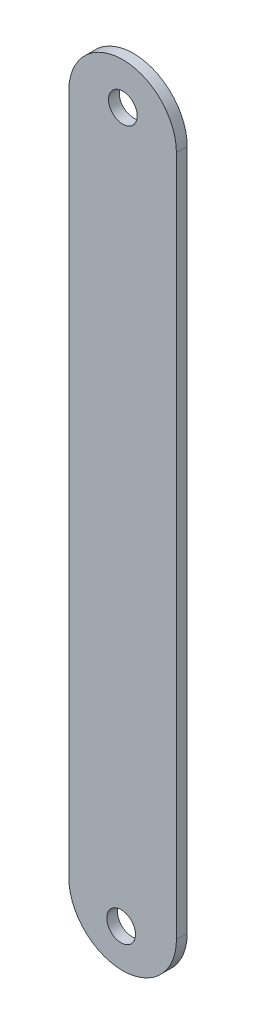
ISO-10303-21;
HEADER;
FILE_DESCRIPTION(('STEP AP214'),'2;1');
FILE_NAME('part.step','',(''),(''),'','','');
FILE_SCHEMA(('AUTOMOTIVE_DESIGN { 1 0 10303 214 1 1 1 1 }'));
ENDSEC;
DATA;
#1=APPLICATION_CONTEXT('core data for automotive mechanical design processes');
#2=APPLICATION_PROTOCOL_DEFINITION('international standard','automotive_design',2000,#1);
#3=PRODUCT_CONTEXT('',#1,'mechanical');
#4=PRODUCT('Part','Part','',(#3));
#5=PRODUCT_RELATED_PRODUCT_CATEGORY('part','',(#4));
#6=PRODUCT_DEFINITION_FORMATION('','',#4);
#7=PRODUCT_DEFINITION_CONTEXT('part definition',#1,'design');
#8=PRODUCT_DEFINITION('design','',#6,#7);
#9=PRODUCT_DEFINITION_SHAPE('','',#8);
#10=(LENGTH_UNIT() NAMED_UNIT(*) SI_UNIT(.MILLI.,.METRE.));
#11=(NAMED_UNIT(*) PLANE_ANGLE_UNIT() SI_UNIT($,.RADIAN.));
#12=(NAMED_UNIT(*) SI_UNIT($,.STERADIAN.) SOLID_ANGLE_UNIT());
#13=UNCERTAINTY_MEASURE_WITH_UNIT(LENGTH_MEASURE(1.E-05),#10,'distance_accuracy_value','');
#14=(GEOMETRIC_REPRESENTATION_CONTEXT(3) GLOBAL_UNCERTAINTY_ASSIGNED_CONTEXT((#13)) GLOBAL_UNIT_ASSIGNED_CONTEXT((#10,
#11,#12)) REPRESENTATION_CONTEXT('',''));
#15=CARTESIAN_POINT('',(0.,0.,0.));
#16=DIRECTION('',(0.,0.,1.));
#17=DIRECTION('',(1.,0.,0.));
#18=AXIS2_PLACEMENT_3D('',#15,#16,#17);
#19=CARTESIAN_POINT('',(-11.2315251364094,57.2093023255814,1.5));
#20=DIRECTION('',(0.,0.,-1.));
#21=DIRECTION('',(-1.,0.,0.));
#22=AXIS2_PLACEMENT_3D('',#19,#20,#21);
#23=CYLINDRICAL_SURFACE('',#22,7.5);
#24=CARTESIAN_POINT('',(-11.2315251364094,57.2093023255814,0.));
#25=DIRECTION('',(0.,0.,1.));
#26=DIRECTION('',(-1.,0.,0.));
#27=AXIS2_PLACEMENT_3D('',#24,#25,#26);
#28=CIRCLE('',#27,7.5);
#29=CARTESIAN_POINT('',(-3.7315251364094,57.2093023255814,0.));
#30=VERTEX_POINT('',#29);
#31=CARTESIAN_POINT('',(-18.7315251364094,57.2093023255814,0.));
#32=VERTEX_POINT('',#31);
#33=EDGE_CURVE('E117',#30,#32,#28,.T.);
#34=ORIENTED_EDGE('',*,*,#33,.T.);
#35=DIRECTION('',(0.,0.,-1.));
#36=VECTOR('',#35,1.);
#37=CARTESIAN_POINT('',(-18.7315251364094,57.2093023255814,1.5));
#38=LINE('',#37,#36);
#39=CARTESIAN_POINT('',(-18.7315251364094,57.2093023255814,1.5));
#40=VERTEX_POINT('',#39);
#41=EDGE_CURVE('E11',#40,#32,#38,.T.);
#42=ORIENTED_EDGE('',*,*,#41,.F.);
#43=CARTESIAN_POINT('',(-11.2315251364094,57.2093023255814,1.5));
#44=DIRECTION('',(0.,0.,1.));
#45=DIRECTION('',(-1.,0.,0.));
#46=AXIS2_PLACEMENT_3D('',#43,#44,#45);
#47=CIRCLE('',#46,7.5);
#48=CARTESIAN_POINT('',(-3.7315251364094,57.2093023255814,1.5));
#49=VERTEX_POINT('',#48);
#50=EDGE_CURVE('E101',#49,#40,#47,.T.);
#51=ORIENTED_EDGE('',*,*,#50,.F.);
#52=DIRECTION('',(0.,0.,-1.));
#53=VECTOR('',#52,1.);
#54=CARTESIAN_POINT('',(-3.7315251364094,57.2093023255814,1.5));
#55=LINE('',#54,#53);
#56=EDGE_CURVE('E113',#49,#30,#55,.T.);
#57=ORIENTED_EDGE('',*,*,#56,.T.);
#58=EDGE_LOOP('',(#34,#42,#51,#57));
#59=FACE_BOUND('',#58,.T.);
#60=ADVANCED_FACE('F49',(#59),#23,.T.);
#61=CARTESIAN_POINT('',(-18.7315251364094,57.2093023255814,1.5));
#62=DIRECTION('',(1.,0.,0.));
#63=DIRECTION('',(0.,1.,0.));
#64=AXIS2_PLACEMENT_3D('',#61,#62,#63);
#65=PLANE('',#64);
#66=DIRECTION('',(0.,-1.,0.));
#67=VECTOR('',#66,1.);
#68=CARTESIAN_POINT('',(-18.7315251364094,57.2093023255814,0.));
#69=LINE('',#68,#67);
#70=CARTESIAN_POINT('',(-18.7315251364094,-37.7906976744186,0.));
#71=VERTEX_POINT('',#70);
#72=EDGE_CURVE('E106',#32,#71,#69,.T.);
#73=ORIENTED_EDGE('',*,*,#72,.T.);
#74=DIRECTION('',(0.,0.,-1.));
#75=VECTOR('',#74,1.);
#76=CARTESIAN_POINT('',(-18.7315251364094,-37.7906976744186,1.5));
#77=LINE('',#76,#75);
#78=CARTESIAN_POINT('',(-18.7315251364094,-37.7906976744186,1.5));
#79=VERTEX_POINT('',#78);
#80=EDGE_CURVE('E58',#79,#71,#77,.T.);
#81=ORIENTED_EDGE('',*,*,#80,.F.);
#82=DIRECTION('',(0.,-1.,0.));
#83=VECTOR('',#82,1.);
#84=CARTESIAN_POINT('',(-18.7315251364094,57.2093023255814,1.5));
#85=LINE('',#84,#83);
#86=EDGE_CURVE('E96',#40,#79,#85,.T.);
#87=ORIENTED_EDGE('',*,*,#86,.F.);
#88=ORIENTED_EDGE('',*,*,#41,.T.);
#89=EDGE_LOOP('',(#73,#81,#87,#88));
#90=FACE_BOUND('',#89,.T.);
#91=ADVANCED_FACE('F105',(#90),#65,.F.);
#92=CARTESIAN_POINT('',(-11.2315251364094,-37.7906976744186,1.5));
#93=DIRECTION('',(0.,0.,-1.));
#94=DIRECTION('',(-1.,0.,0.));
#95=AXIS2_PLACEMENT_3D('',#92,#93,#94);
#96=CYLINDRICAL_SURFACE('',#95,7.5);
#97=CARTESIAN_POINT('',(-11.2315251364094,-37.7906976744186,0.));
#98=DIRECTION('',(0.,0.,1.));
#99=DIRECTION('',(1.,0.,0.));
#100=AXIS2_PLACEMENT_3D('',#97,#98,#99);
#101=CIRCLE('',#100,7.5);
#102=CARTESIAN_POINT('',(-3.73152513640939,-37.7906976744186,0.));
#103=VERTEX_POINT('',#102);
#104=EDGE_CURVE('E83',#71,#103,#101,.T.);
#105=ORIENTED_EDGE('',*,*,#104,.T.);
#106=DIRECTION('',(0.,0.,-1.));
#107=VECTOR('',#106,1.);
#108=CARTESIAN_POINT('',(-3.73152513640939,-37.7906976744186,1.5));
#109=LINE('',#108,#107);
#110=CARTESIAN_POINT('',(-3.73152513640939,-37.7906976744186,1.5));
#111=VERTEX_POINT('',#110);
#112=EDGE_CURVE('E108',#111,#103,#109,.T.);
#113=ORIENTED_EDGE('',*,*,#112,.F.);
#114=CARTESIAN_POINT('',(-11.2315251364094,-37.7906976744186,1.5));
#115=DIRECTION('',(0.,0.,1.));
#116=DIRECTION('',(1.,0.,0.));
#117=AXIS2_PLACEMENT_3D('',#114,#115,#116);
#118=CIRCLE('',#117,7.5);
#119=EDGE_CURVE('E99',#79,#111,#118,.T.);
#120=ORIENTED_EDGE('',*,*,#119,.F.);
#121=ORIENTED_EDGE('',*,*,#80,.T.);
#122=EDGE_LOOP('',(#105,#113,#120,#121));
#123=FACE_BOUND('',#122,.T.);
#124=ADVANCED_FACE('F109',(#123),#96,.T.);
#125=CARTESIAN_POINT('',(-3.7315251364094,57.2093023255814,1.5));
#126=DIRECTION('',(-1.,0.,0.));
#127=DIRECTION('',(0.,-1.,0.));
#128=AXIS2_PLACEMENT_3D('',#125,#126,#127);
#129=PLANE('',#128);
#130=DIRECTION('',(0.,1.,0.));
#131=VECTOR('',#130,1.);
#132=CARTESIAN_POINT('',(-3.7315251364094,57.2093023255814,0.));
#133=LINE('',#132,#131);
#134=EDGE_CURVE('E89',#103,#30,#133,.T.);
#135=ORIENTED_EDGE('',*,*,#134,.T.);
#136=ORIENTED_EDGE('',*,*,#56,.F.);
#137=DIRECTION('',(0.,1.,0.));
#138=VECTOR('',#137,1.);
#139=CARTESIAN_POINT('',(-3.7315251364094,57.2093023255814,1.5));
#140=LINE('',#139,#138);
#141=EDGE_CURVE('E66',#111,#49,#140,.T.);
#142=ORIENTED_EDGE('',*,*,#141,.F.);
#143=ORIENTED_EDGE('',*,*,#112,.T.);
#144=EDGE_LOOP('',(#135,#136,#142,#143));
#145=FACE_BOUND('',#144,.T.);
#146=ADVANCED_FACE('F131',(#145),#129,.F.);
#147=CARTESIAN_POINT('',(-11.2315251364094,57.2093023255814,1.5));
#148=DIRECTION('',(0.,0.,-1.));
#149=DIRECTION('',(-1.,0.,0.));
#150=AXIS2_PLACEMENT_3D('',#147,#148,#149);
#151=PLANE('',#150);
#152=CARTESIAN_POINT('',(-11.20285502595,58.9110441322353,1.5));
#153=DIRECTION('',(0.,0.,1.));
#154=DIRECTION('',(1.,0.,0.));
#155=AXIS2_PLACEMENT_3D('',#152,#153,#154);
#156=CIRCLE('',#155,2.);
#157=CARTESIAN_POINT('',(-9.20285502594996,58.9110441322353,1.5));
#158=VERTEX_POINT('',#157);
#159=EDGE_CURVE('E146',#158,#158,#156,.T.);
#160=ORIENTED_EDGE('',*,*,#159,.F.);
#161=EDGE_LOOP('',(#160));
#162=FACE_BOUND('',#161,.T.);
#163=CARTESIAN_POINT('',(-11.4403988573682,-40.0294478876406,1.5));
#164=DIRECTION('',(0.,0.,1.));
#165=DIRECTION('',(1.,0.,0.));
#166=AXIS2_PLACEMENT_3D('',#163,#164,#165);
#167=CIRCLE('',#166,2.);
#168=CARTESIAN_POINT('',(-9.4403988573682,-40.0294478876406,1.5));
#169=VERTEX_POINT('',#168);
#170=EDGE_CURVE('E142',#169,#169,#167,.T.);
#171=ORIENTED_EDGE('',*,*,#170,.F.);
#172=EDGE_LOOP('',(#171));
#173=FACE_BOUND('',#172,.T.);
#174=ORIENTED_EDGE('',*,*,#50,.T.);
#175=ORIENTED_EDGE('',*,*,#86,.T.);
#176=ORIENTED_EDGE('',*,*,#119,.T.);
#177=ORIENTED_EDGE('',*,*,#141,.T.);
#178=EDGE_LOOP('',(#174,#175,#176,#177));
#179=FACE_BOUND('',#178,.T.);
#180=ADVANCED_FACE('F97',(#162,#173,#179),#151,.F.);
#181=CARTESIAN_POINT('',(-11.2315251364094,57.2093023255814,0.));
#182=DIRECTION('',(0.,0.,-1.));
#183=DIRECTION('',(-1.,0.,0.));
#184=AXIS2_PLACEMENT_3D('',#181,#182,#183);
#185=PLANE('',#184);
#186=CARTESIAN_POINT('',(-11.20285502595,58.9110441322353,0.));
#187=DIRECTION('',(0.,0.,1.));
#188=DIRECTION('',(1.,0.,0.));
#189=AXIS2_PLACEMENT_3D('',#186,#187,#188);
#190=CIRCLE('',#189,2.);
#191=CARTESIAN_POINT('',(-9.20285502594996,58.9110441322353,0.));
#192=VERTEX_POINT('',#191);
#193=EDGE_CURVE('E121',#192,#192,#190,.T.);
#194=ORIENTED_EDGE('',*,*,#193,.T.);
#195=EDGE_LOOP('',(#194));
#196=FACE_BOUND('',#195,.T.);
#197=CARTESIAN_POINT('',(-11.4403988573682,-40.0294478876406,0.));
#198=DIRECTION('',(0.,0.,1.));
#199=DIRECTION('',(1.,0.,0.));
#200=AXIS2_PLACEMENT_3D('',#197,#198,#199);
#201=CIRCLE('',#200,2.);
#202=CARTESIAN_POINT('',(-9.4403988573682,-40.0294478876406,0.));
#203=VERTEX_POINT('',#202);
#204=EDGE_CURVE('E138',#203,#203,#201,.T.);
#205=ORIENTED_EDGE('',*,*,#204,.T.);
#206=EDGE_LOOP('',(#205));
#207=FACE_BOUND('',#206,.T.);
#208=ORIENTED_EDGE('',*,*,#33,.F.);
#209=ORIENTED_EDGE('',*,*,#134,.F.);
#210=ORIENTED_EDGE('',*,*,#104,.F.);
#211=ORIENTED_EDGE('',*,*,#72,.F.);
#212=EDGE_LOOP('',(#208,#209,#210,#211));
#213=FACE_BOUND('',#212,.T.);
#214=ADVANCED_FACE('F134',(#196,#207,#213),#185,.T.);
#215=CARTESIAN_POINT('',(-11.4403988573682,-40.0294478876406,0.));
#216=DIRECTION('',(0.,0.,1.));
#217=DIRECTION('',(1.,0.,0.));
#218=AXIS2_PLACEMENT_3D('',#215,#216,#217);
#219=CYLINDRICAL_SURFACE('',#218,2.);
#220=ORIENTED_EDGE('',*,*,#204,.F.);
#221=EDGE_LOOP('',(#220));
#222=FACE_BOUND('',#221,.T.);
#223=ORIENTED_EDGE('',*,*,#170,.T.);
#224=EDGE_LOOP('',(#223));
#225=FACE_BOUND('',#224,.T.);
#226=ADVANCED_FACE('F159',(#222,#225),#219,.F.);
#227=CARTESIAN_POINT('',(-11.20285502595,58.9110441322353,0.));
#228=DIRECTION('',(0.,0.,1.));
#229=DIRECTION('',(1.,0.,0.));
#230=AXIS2_PLACEMENT_3D('',#227,#228,#229);
#231=CYLINDRICAL_SURFACE('',#230,2.);
#232=ORIENTED_EDGE('',*,*,#193,.F.);
#233=EDGE_LOOP('',(#232));
#234=FACE_BOUND('',#233,.T.);
#235=ORIENTED_EDGE('',*,*,#159,.T.);
#236=EDGE_LOOP('',(#235));
#237=FACE_BOUND('',#236,.T.);
#238=ADVANCED_FACE('F156',(#234,#237),#231,.F.);
#239=CLOSED_SHELL('',(#60,#91,#124,#146,#180,#214,#226,#238));
#240=MANIFOLD_SOLID_BREP('B2',#239);
#241=ADVANCED_BREP_SHAPE_REPRESENTATION('',(#18,#240),#14);
#242=SHAPE_DEFINITION_REPRESENTATION(#9,#241);
ENDSEC;
END-ISO-10303-21;
